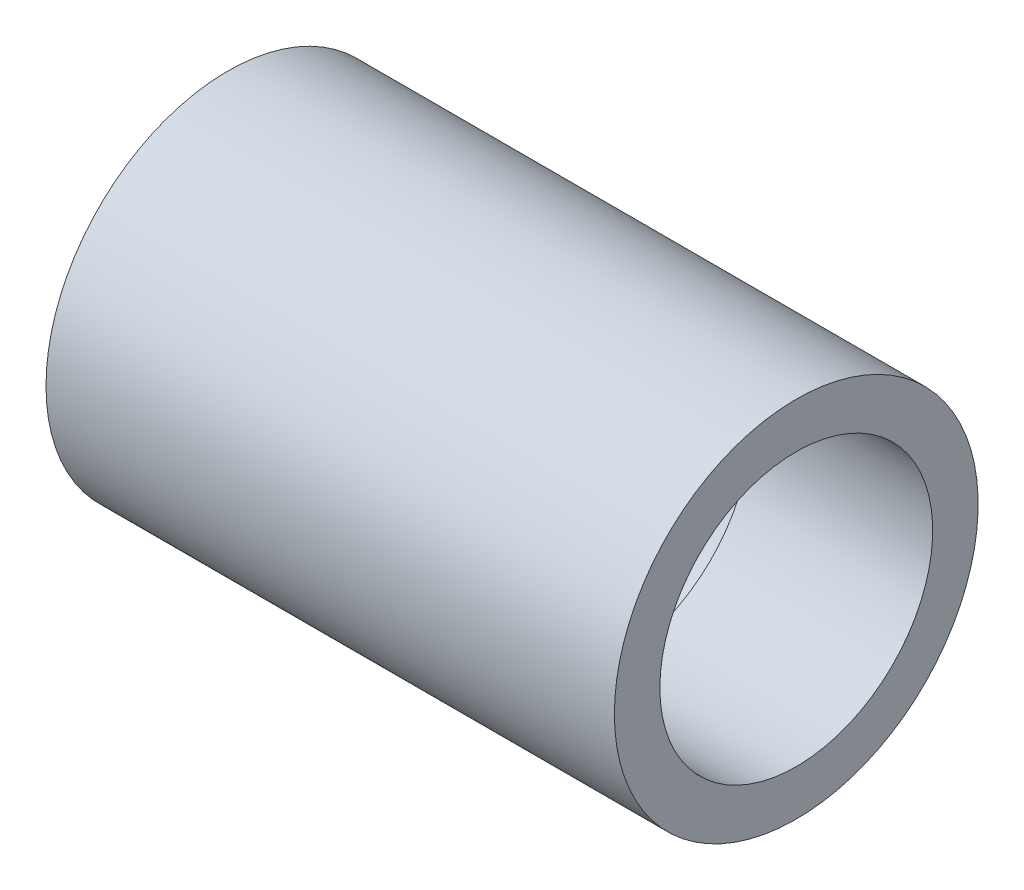
ISO-10303-21;
HEADER;
FILE_DESCRIPTION(('STEP AP214'),'2;1');
FILE_NAME('part.step','',(''),(''),'','','');
FILE_SCHEMA(('AUTOMOTIVE_DESIGN { 1 0 10303 214 1 1 1 1 }'));
ENDSEC;
DATA;
#1=APPLICATION_CONTEXT('core data for automotive mechanical design processes');
#2=APPLICATION_PROTOCOL_DEFINITION('international standard','automotive_design',2000,#1);
#3=PRODUCT_CONTEXT('',#1,'mechanical');
#4=PRODUCT('Part','Part','',(#3));
#5=PRODUCT_RELATED_PRODUCT_CATEGORY('part','',(#4));
#6=PRODUCT_DEFINITION_FORMATION('','',#4);
#7=PRODUCT_DEFINITION_CONTEXT('part definition',#1,'design');
#8=PRODUCT_DEFINITION('design','',#6,#7);
#9=PRODUCT_DEFINITION_SHAPE('','',#8);
#10=(LENGTH_UNIT() NAMED_UNIT(*) SI_UNIT(.MILLI.,.METRE.));
#11=(NAMED_UNIT(*) PLANE_ANGLE_UNIT() SI_UNIT($,.RADIAN.));
#12=(NAMED_UNIT(*) SI_UNIT($,.STERADIAN.) SOLID_ANGLE_UNIT());
#13=UNCERTAINTY_MEASURE_WITH_UNIT(LENGTH_MEASURE(1.E-05),#10,'distance_accuracy_value','');
#14=(GEOMETRIC_REPRESENTATION_CONTEXT(3) GLOBAL_UNCERTAINTY_ASSIGNED_CONTEXT((#13)) GLOBAL_UNIT_ASSIGNED_CONTEXT((#10,
#11,#12)) REPRESENTATION_CONTEXT('',''));
#15=CARTESIAN_POINT('',(0.,0.,0.));
#16=DIRECTION('',(0.,0.,1.));
#17=DIRECTION('',(1.,0.,0.));
#18=AXIS2_PLACEMENT_3D('',#15,#16,#17);
#19=CARTESIAN_POINT('',(-12.5,8.,0.));
#20=DIRECTION('',(1.,0.,0.));
#21=DIRECTION('',(0.,0.,-1.));
#22=AXIS2_PLACEMENT_3D('',#19,#20,#21);
#23=PLANE('',#22);
#24=CARTESIAN_POINT('',(-12.5,0.,0.));
#25=DIRECTION('',(-1.,0.,0.));
#26=DIRECTION('',(0.,0.,1.));
#27=AXIS2_PLACEMENT_3D('',#24,#25,#26);
#28=CIRCLE('',#27,6.);
#29=CARTESIAN_POINT('',(-12.5,0.,6.));
#30=VERTEX_POINT('',#29);
#31=EDGE_CURVE('E10',#30,#30,#28,.T.);
#32=ORIENTED_EDGE('',*,*,#31,.F.);
#33=EDGE_LOOP('',(#32));
#34=FACE_BOUND('',#33,.T.);
#35=CARTESIAN_POINT('',(-12.5,0.,0.));
#36=DIRECTION('',(-1.,0.,0.));
#37=DIRECTION('',(0.,0.,1.));
#38=AXIS2_PLACEMENT_3D('',#35,#36,#37);
#39=CIRCLE('',#38,8.);
#40=CARTESIAN_POINT('',(-12.5,0.,8.));
#41=VERTEX_POINT('',#40);
#42=EDGE_CURVE('E78',#41,#41,#39,.T.);
#43=ORIENTED_EDGE('',*,*,#42,.T.);
#44=EDGE_LOOP('',(#43));
#45=FACE_BOUND('',#44,.T.);
#46=ADVANCED_FACE('F43',(#34,#45),#23,.F.);
#47=CARTESIAN_POINT('',(-6.25771537223928,0.,0.));
#48=DIRECTION('',(-1.,0.,0.));
#49=DIRECTION('',(0.,0.,1.));
#50=AXIS2_PLACEMENT_3D('',#47,#48,#49);
#51=CYLINDRICAL_SURFACE('',#50,6.);
#52=CARTESIAN_POINT('',(-4.5,0.,0.));
#53=DIRECTION('',(-1.,0.,0.));
#54=DIRECTION('',(0.,0.,1.));
#55=AXIS2_PLACEMENT_3D('',#52,#53,#54);
#56=CIRCLE('',#55,6.);
#57=CARTESIAN_POINT('',(-4.5,0.,6.));
#58=VERTEX_POINT('',#57);
#59=EDGE_CURVE('E50',#58,#58,#56,.T.);
#60=ORIENTED_EDGE('',*,*,#59,.F.);
#61=EDGE_LOOP('',(#60));
#62=FACE_BOUND('',#61,.T.);
#63=ORIENTED_EDGE('',*,*,#31,.T.);
#64=EDGE_LOOP('',(#63));
#65=FACE_BOUND('',#64,.T.);
#66=ADVANCED_FACE('F116',(#62,#65),#51,.F.);
#67=CARTESIAN_POINT('',(-4.5,6.,0.));
#68=DIRECTION('',(-1.,0.,0.));
#69=DIRECTION('',(0.,0.,1.));
#70=AXIS2_PLACEMENT_3D('',#67,#68,#69);
#71=PLANE('',#70);
#72=CARTESIAN_POINT('',(-4.5,0.,0.));
#73=DIRECTION('',(-1.,0.,0.));
#74=DIRECTION('',(0.,0.,1.));
#75=AXIS2_PLACEMENT_3D('',#72,#73,#74);
#76=CIRCLE('',#75,6.5);
#77=CARTESIAN_POINT('',(-4.5,0.,6.5));
#78=VERTEX_POINT('',#77);
#79=EDGE_CURVE('E55',#78,#78,#76,.T.);
#80=ORIENTED_EDGE('',*,*,#79,.F.);
#81=EDGE_LOOP('',(#80));
#82=FACE_BOUND('',#81,.T.);
#83=ORIENTED_EDGE('',*,*,#59,.T.);
#84=EDGE_LOOP('',(#83));
#85=FACE_BOUND('',#84,.T.);
#86=ADVANCED_FACE('F111',(#82,#85),#71,.F.);
#87=CARTESIAN_POINT('',(-6.25771537223928,0.,0.));
#88=DIRECTION('',(-1.,0.,0.));
#89=DIRECTION('',(0.,0.,1.));
#90=AXIS2_PLACEMENT_3D('',#87,#88,#89);
#91=CYLINDRICAL_SURFACE('',#90,6.5);
#92=CARTESIAN_POINT('',(4.5,0.,0.));
#93=DIRECTION('',(-1.,0.,0.));
#94=DIRECTION('',(0.,0.,1.));
#95=AXIS2_PLACEMENT_3D('',#92,#93,#94);
#96=CIRCLE('',#95,6.5);
#97=CARTESIAN_POINT('',(4.5,0.,6.5));
#98=VERTEX_POINT('',#97);
#99=EDGE_CURVE('E60',#98,#98,#96,.T.);
#100=ORIENTED_EDGE('',*,*,#99,.F.);
#101=EDGE_LOOP('',(#100));
#102=FACE_BOUND('',#101,.T.);
#103=ORIENTED_EDGE('',*,*,#79,.T.);
#104=EDGE_LOOP('',(#103));
#105=FACE_BOUND('',#104,.T.);
#106=ADVANCED_FACE('F105',(#102,#105),#91,.F.);
#107=CARTESIAN_POINT('',(4.5,6.5,0.));
#108=DIRECTION('',(1.,0.,0.));
#109=DIRECTION('',(0.,0.,-1.));
#110=AXIS2_PLACEMENT_3D('',#107,#108,#109);
#111=PLANE('',#110);
#112=CARTESIAN_POINT('',(4.5,0.,0.));
#113=DIRECTION('',(-1.,0.,0.));
#114=DIRECTION('',(0.,0.,1.));
#115=AXIS2_PLACEMENT_3D('',#112,#113,#114);
#116=CIRCLE('',#115,6.);
#117=CARTESIAN_POINT('',(4.5,0.,6.));
#118=VERTEX_POINT('',#117);
#119=EDGE_CURVE('E66',#118,#118,#116,.T.);
#120=ORIENTED_EDGE('',*,*,#119,.F.);
#121=EDGE_LOOP('',(#120));
#122=FACE_BOUND('',#121,.T.);
#123=ORIENTED_EDGE('',*,*,#99,.T.);
#124=EDGE_LOOP('',(#123));
#125=FACE_BOUND('',#124,.T.);
#126=ADVANCED_FACE('F99',(#122,#125),#111,.F.);
#127=CARTESIAN_POINT('',(-6.25771537223928,0.,0.));
#128=DIRECTION('',(-1.,0.,0.));
#129=DIRECTION('',(0.,0.,1.));
#130=AXIS2_PLACEMENT_3D('',#127,#128,#129);
#131=CYLINDRICAL_SURFACE('',#130,6.);
#132=CARTESIAN_POINT('',(12.5,0.,0.));
#133=DIRECTION('',(-1.,0.,0.));
#134=DIRECTION('',(0.,0.,1.));
#135=AXIS2_PLACEMENT_3D('',#132,#133,#134);
#136=CIRCLE('',#135,6.);
#137=CARTESIAN_POINT('',(12.5,0.,6.));
#138=VERTEX_POINT('',#137);
#139=EDGE_CURVE('E70',#138,#138,#136,.T.);
#140=ORIENTED_EDGE('',*,*,#139,.F.);
#141=EDGE_LOOP('',(#140));
#142=FACE_BOUND('',#141,.T.);
#143=ORIENTED_EDGE('',*,*,#119,.T.);
#144=EDGE_LOOP('',(#143));
#145=FACE_BOUND('',#144,.T.);
#146=ADVANCED_FACE('F93',(#142,#145),#131,.F.);
#147=CARTESIAN_POINT('',(12.5,6.,0.));
#148=DIRECTION('',(-1.,0.,0.));
#149=DIRECTION('',(0.,0.,1.));
#150=AXIS2_PLACEMENT_3D('',#147,#148,#149);
#151=PLANE('',#150);
#152=CARTESIAN_POINT('',(12.5,0.,0.));
#153=DIRECTION('',(-1.,0.,0.));
#154=DIRECTION('',(0.,0.,1.));
#155=AXIS2_PLACEMENT_3D('',#152,#153,#154);
#156=CIRCLE('',#155,8.);
#157=CARTESIAN_POINT('',(12.5,0.,8.));
#158=VERTEX_POINT('',#157);
#159=EDGE_CURVE('E74',#158,#158,#156,.T.);
#160=ORIENTED_EDGE('',*,*,#159,.F.);
#161=EDGE_LOOP('',(#160));
#162=FACE_BOUND('',#161,.T.);
#163=ORIENTED_EDGE('',*,*,#139,.T.);
#164=EDGE_LOOP('',(#163));
#165=FACE_BOUND('',#164,.T.);
#166=ADVANCED_FACE('F87',(#162,#165),#151,.F.);
#167=CARTESIAN_POINT('',(-6.25771537223928,0.,0.));
#168=DIRECTION('',(-1.,0.,0.));
#169=DIRECTION('',(0.,0.,1.));
#170=AXIS2_PLACEMENT_3D('',#167,#168,#169);
#171=CYLINDRICAL_SURFACE('',#170,8.);
#172=ORIENTED_EDGE('',*,*,#42,.F.);
#173=EDGE_LOOP('',(#172));
#174=FACE_BOUND('',#173,.T.);
#175=ORIENTED_EDGE('',*,*,#159,.T.);
#176=EDGE_LOOP('',(#175));
#177=FACE_BOUND('',#176,.T.);
#178=ADVANCED_FACE('F84',(#174,#177),#171,.T.);
#179=CLOSED_SHELL('',(#46,#66,#86,#106,#126,#146,#166,#178));
#180=MANIFOLD_SOLID_BREP('B2',#179);
#181=ADVANCED_BREP_SHAPE_REPRESENTATION('',(#18,#180),#14);
#182=SHAPE_DEFINITION_REPRESENTATION(#9,#181);
ENDSEC;
END-ISO-10303-21;
